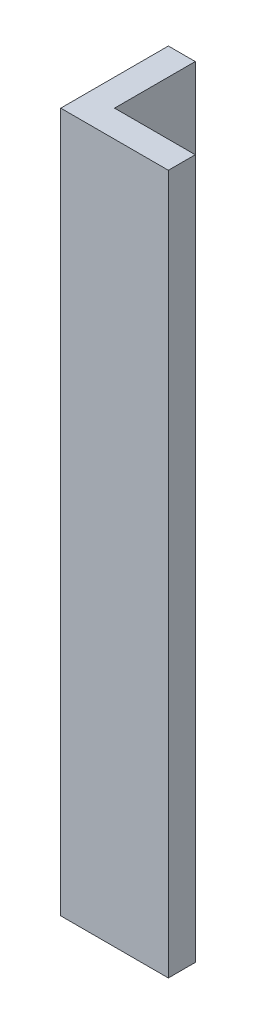
ISO-10303-21;
HEADER;
FILE_DESCRIPTION(('STEP AP214'),'2;1');
FILE_NAME('part.step','',(''),(''),'','','');
FILE_SCHEMA(('AUTOMOTIVE_DESIGN { 1 0 10303 214 1 1 1 1 }'));
ENDSEC;
DATA;
#1=APPLICATION_CONTEXT('core data for automotive mechanical design processes');
#2=APPLICATION_PROTOCOL_DEFINITION('international standard','automotive_design',2000,#1);
#3=PRODUCT_CONTEXT('',#1,'mechanical');
#4=PRODUCT('Part','Part','',(#3));
#5=PRODUCT_RELATED_PRODUCT_CATEGORY('part','',(#4));
#6=PRODUCT_DEFINITION_FORMATION('','',#4);
#7=PRODUCT_DEFINITION_CONTEXT('part definition',#1,'design');
#8=PRODUCT_DEFINITION('design','',#6,#7);
#9=PRODUCT_DEFINITION_SHAPE('','',#8);
#10=(LENGTH_UNIT() NAMED_UNIT(*) SI_UNIT(.MILLI.,.METRE.));
#11=(NAMED_UNIT(*) PLANE_ANGLE_UNIT() SI_UNIT($,.RADIAN.));
#12=(NAMED_UNIT(*) SI_UNIT($,.STERADIAN.) SOLID_ANGLE_UNIT());
#13=UNCERTAINTY_MEASURE_WITH_UNIT(LENGTH_MEASURE(1.E-05),#10,'distance_accuracy_value','');
#14=(GEOMETRIC_REPRESENTATION_CONTEXT(3) GLOBAL_UNCERTAINTY_ASSIGNED_CONTEXT((#13)) GLOBAL_UNIT_ASSIGNED_CONTEXT((#10,
#11,#12)) REPRESENTATION_CONTEXT('',''));
#15=CARTESIAN_POINT('',(0.,0.,0.));
#16=DIRECTION('',(0.,0.,1.));
#17=DIRECTION('',(1.,0.,0.));
#18=AXIS2_PLACEMENT_3D('',#15,#16,#17);
#19=CARTESIAN_POINT('',(3.09677419354837,130.,0.));
#20=DIRECTION('',(1.,0.,0.));
#21=DIRECTION('',(0.,0.,-1.));
#22=AXIS2_PLACEMENT_3D('',#19,#20,#21);
#23=PLANE('',#22);
#24=DIRECTION('',(0.,0.,1.));
#25=VECTOR('',#24,1.);
#26=CARTESIAN_POINT('',(3.09677419354837,0.,0.));
#27=LINE('',#26,#25);
#28=CARTESIAN_POINT('',(3.09677419354838,0.,5.64516129032258));
#29=VERTEX_POINT('',#28);
#30=CARTESIAN_POINT('',(3.09677419354839,0.,10.6451612903226));
#31=VERTEX_POINT('',#30);
#32=EDGE_CURVE('E127',#29,#31,#27,.T.);
#33=ORIENTED_EDGE('',*,*,#32,.F.);
#34=DIRECTION('',(0.,-1.,0.));
#35=VECTOR('',#34,1.);
#36=CARTESIAN_POINT('',(3.09677419354838,130.,5.64516129032258));
#37=LINE('',#36,#35);
#38=CARTESIAN_POINT('',(3.09677419354838,130.,5.64516129032258));
#39=VERTEX_POINT('',#38);
#40=EDGE_CURVE('E11',#39,#29,#37,.T.);
#41=ORIENTED_EDGE('',*,*,#40,.F.);
#42=DIRECTION('',(0.,0.,1.));
#43=VECTOR('',#42,1.);
#44=CARTESIAN_POINT('',(3.09677419354837,130.,0.));
#45=LINE('',#44,#43);
#46=CARTESIAN_POINT('',(3.09677419354839,130.,10.6451612903226));
#47=VERTEX_POINT('',#46);
#48=EDGE_CURVE('E146',#39,#47,#45,.T.);
#49=ORIENTED_EDGE('',*,*,#48,.T.);
#50=DIRECTION('',(0.,-1.,0.));
#51=VECTOR('',#50,1.);
#52=CARTESIAN_POINT('',(3.09677419354839,130.,10.6451612903226));
#53=LINE('',#52,#51);
#54=EDGE_CURVE('E84',#47,#31,#53,.T.);
#55=ORIENTED_EDGE('',*,*,#54,.T.);
#56=EDGE_LOOP('',(#33,#41,#49,#55));
#57=FACE_BOUND('',#56,.T.);
#58=ADVANCED_FACE('F39',(#57),#23,.T.);
#59=CARTESIAN_POINT('',(0.,130.,5.64516129032258));
#60=DIRECTION('',(0.,0.,-1.));
#61=DIRECTION('',(-1.,0.,0.));
#62=AXIS2_PLACEMENT_3D('',#59,#60,#61);
#63=PLANE('',#62);
#64=DIRECTION('',(1.,0.,0.));
#65=VECTOR('',#64,1.);
#66=CARTESIAN_POINT('',(0.,0.,5.64516129032258));
#67=LINE('',#66,#65);
#68=CARTESIAN_POINT('',(-11.9032258064516,0.,5.64516129032258));
#69=VERTEX_POINT('',#68);
#70=EDGE_CURVE('E131',#69,#29,#67,.T.);
#71=ORIENTED_EDGE('',*,*,#70,.F.);
#72=DIRECTION('',(0.,-1.,0.));
#73=VECTOR('',#72,1.);
#74=CARTESIAN_POINT('',(-11.9032258064516,130.,5.64516129032258));
#75=LINE('',#74,#73);
#76=CARTESIAN_POINT('',(-11.9032258064516,130.,5.64516129032258));
#77=VERTEX_POINT('',#76);
#78=EDGE_CURVE('E48',#77,#69,#75,.T.);
#79=ORIENTED_EDGE('',*,*,#78,.F.);
#80=DIRECTION('',(1.,0.,0.));
#81=VECTOR('',#80,1.);
#82=CARTESIAN_POINT('',(0.,130.,5.64516129032258));
#83=LINE('',#82,#81);
#84=EDGE_CURVE('E121',#77,#39,#83,.T.);
#85=ORIENTED_EDGE('',*,*,#84,.T.);
#86=ORIENTED_EDGE('',*,*,#40,.T.);
#87=EDGE_LOOP('',(#71,#79,#85,#86));
#88=FACE_BOUND('',#87,.T.);
#89=ADVANCED_FACE('F159',(#88),#63,.T.);
#90=CARTESIAN_POINT('',(-11.9032258064516,130.,0.));
#91=DIRECTION('',(1.,0.,0.));
#92=DIRECTION('',(0.,0.,-1.));
#93=AXIS2_PLACEMENT_3D('',#90,#91,#92);
#94=PLANE('',#93);
#95=DIRECTION('',(0.,0.,1.));
#96=VECTOR('',#95,1.);
#97=CARTESIAN_POINT('',(-11.9032258064516,0.,0.));
#98=LINE('',#97,#96);
#99=CARTESIAN_POINT('',(-11.9032258064516,0.,-9.35483870967742));
#100=VERTEX_POINT('',#99);
#101=EDGE_CURVE('E135',#100,#69,#98,.T.);
#102=ORIENTED_EDGE('',*,*,#101,.F.);
#103=DIRECTION('',(0.,-1.,0.));
#104=VECTOR('',#103,1.);
#105=CARTESIAN_POINT('',(-11.9032258064516,130.,-9.35483870967742));
#106=LINE('',#105,#104);
#107=CARTESIAN_POINT('',(-11.9032258064516,130.,-9.35483870967742));
#108=VERTEX_POINT('',#107);
#109=EDGE_CURVE('E106',#108,#100,#106,.T.);
#110=ORIENTED_EDGE('',*,*,#109,.F.);
#111=DIRECTION('',(0.,0.,1.));
#112=VECTOR('',#111,1.);
#113=CARTESIAN_POINT('',(-11.9032258064516,130.,0.));
#114=LINE('',#113,#112);
#115=EDGE_CURVE('E117',#108,#77,#114,.T.);
#116=ORIENTED_EDGE('',*,*,#115,.T.);
#117=ORIENTED_EDGE('',*,*,#78,.T.);
#118=EDGE_LOOP('',(#102,#110,#116,#117));
#119=FACE_BOUND('',#118,.T.);
#120=ADVANCED_FACE('F156',(#119),#94,.T.);
#121=CARTESIAN_POINT('',(0.,130.,-9.35483870967742));
#122=DIRECTION('',(0.,0.,-1.));
#123=DIRECTION('',(-1.,0.,0.));
#124=AXIS2_PLACEMENT_3D('',#121,#122,#123);
#125=PLANE('',#124);
#126=DIRECTION('',(1.,0.,0.));
#127=VECTOR('',#126,1.);
#128=CARTESIAN_POINT('',(0.,0.,-9.35483870967742));
#129=LINE('',#128,#127);
#130=CARTESIAN_POINT('',(-16.9032258064516,0.,-9.35483870967742));
#131=VERTEX_POINT('',#130);
#132=EDGE_CURVE('E104',#131,#100,#129,.T.);
#133=ORIENTED_EDGE('',*,*,#132,.F.);
#134=DIRECTION('',(0.,-1.,0.));
#135=VECTOR('',#134,1.);
#136=CARTESIAN_POINT('',(-16.9032258064516,130.,-9.35483870967742));
#137=LINE('',#136,#135);
#138=CARTESIAN_POINT('',(-16.9032258064516,130.,-9.35483870967742));
#139=VERTEX_POINT('',#138);
#140=EDGE_CURVE('E98',#139,#131,#137,.T.);
#141=ORIENTED_EDGE('',*,*,#140,.F.);
#142=DIRECTION('',(1.,0.,0.));
#143=VECTOR('',#142,1.);
#144=CARTESIAN_POINT('',(0.,130.,-9.35483870967742));
#145=LINE('',#144,#143);
#146=EDGE_CURVE('E102',#139,#108,#145,.T.);
#147=ORIENTED_EDGE('',*,*,#146,.T.);
#148=ORIENTED_EDGE('',*,*,#109,.T.);
#149=EDGE_LOOP('',(#133,#141,#147,#148));
#150=FACE_BOUND('',#149,.T.);
#151=ADVANCED_FACE('F100',(#150),#125,.T.);
#152=CARTESIAN_POINT('',(-16.9032258064516,130.,0.));
#153=DIRECTION('',(1.,0.,0.));
#154=DIRECTION('',(0.,0.,-1.));
#155=AXIS2_PLACEMENT_3D('',#152,#153,#154);
#156=PLANE('',#155);
#157=DIRECTION('',(0.,0.,1.));
#158=VECTOR('',#157,1.);
#159=CARTESIAN_POINT('',(-16.9032258064516,0.,0.));
#160=LINE('',#159,#158);
#161=CARTESIAN_POINT('',(-16.9032258064516,0.,10.6451612903226));
#162=VERTEX_POINT('',#161);
#163=EDGE_CURVE('E77',#131,#162,#160,.T.);
#164=ORIENTED_EDGE('',*,*,#163,.T.);
#165=DIRECTION('',(0.,-1.,0.));
#166=VECTOR('',#165,1.);
#167=CARTESIAN_POINT('',(-16.9032258064516,130.,10.6451612903226));
#168=LINE('',#167,#166);
#169=CARTESIAN_POINT('',(-16.9032258064516,130.,10.6451612903226));
#170=VERTEX_POINT('',#169);
#171=EDGE_CURVE('E107',#170,#162,#168,.T.);
#172=ORIENTED_EDGE('',*,*,#171,.F.);
#173=DIRECTION('',(0.,0.,1.));
#174=VECTOR('',#173,1.);
#175=CARTESIAN_POINT('',(-16.9032258064516,130.,0.));
#176=LINE('',#175,#174);
#177=EDGE_CURVE('E109',#139,#170,#176,.T.);
#178=ORIENTED_EDGE('',*,*,#177,.F.);
#179=ORIENTED_EDGE('',*,*,#140,.T.);
#180=EDGE_LOOP('',(#164,#172,#178,#179));
#181=FACE_BOUND('',#180,.T.);
#182=ADVANCED_FACE('F110',(#181),#156,.F.);
#183=CARTESIAN_POINT('',(0.,130.,10.6451612903226));
#184=DIRECTION('',(0.,0.,-1.));
#185=DIRECTION('',(-1.,0.,0.));
#186=AXIS2_PLACEMENT_3D('',#183,#184,#185);
#187=PLANE('',#186);
#188=DIRECTION('',(1.,0.,0.));
#189=VECTOR('',#188,1.);
#190=CARTESIAN_POINT('',(0.,0.,10.6451612903226));
#191=LINE('',#190,#189);
#192=EDGE_CURVE('E143',#162,#31,#191,.T.);
#193=ORIENTED_EDGE('',*,*,#192,.T.);
#194=ORIENTED_EDGE('',*,*,#54,.F.);
#195=DIRECTION('',(1.,0.,0.));
#196=VECTOR('',#195,1.);
#197=CARTESIAN_POINT('',(0.,130.,10.6451612903226));
#198=LINE('',#197,#196);
#199=EDGE_CURVE('E56',#170,#47,#198,.T.);
#200=ORIENTED_EDGE('',*,*,#199,.F.);
#201=ORIENTED_EDGE('',*,*,#171,.T.);
#202=EDGE_LOOP('',(#193,#194,#200,#201));
#203=FACE_BOUND('',#202,.T.);
#204=ADVANCED_FACE('F164',(#203),#187,.F.);
#205=CARTESIAN_POINT('',(0.,130.,0.));
#206=DIRECTION('',(0.,1.,0.));
#207=DIRECTION('',(0.,0.,1.));
#208=AXIS2_PLACEMENT_3D('',#205,#206,#207);
#209=PLANE('',#208);
#210=ORIENTED_EDGE('',*,*,#48,.F.);
#211=ORIENTED_EDGE('',*,*,#84,.F.);
#212=ORIENTED_EDGE('',*,*,#115,.F.);
#213=ORIENTED_EDGE('',*,*,#146,.F.);
#214=ORIENTED_EDGE('',*,*,#177,.T.);
#215=ORIENTED_EDGE('',*,*,#199,.T.);
#216=EDGE_LOOP('',(#210,#211,#212,#213,#214,#215));
#217=FACE_BOUND('',#216,.T.);
#218=ADVANCED_FACE('F114',(#217),#209,.T.);
#219=CARTESIAN_POINT('',(0.,0.,0.));
#220=DIRECTION('',(0.,1.,0.));
#221=DIRECTION('',(0.,0.,1.));
#222=AXIS2_PLACEMENT_3D('',#219,#220,#221);
#223=PLANE('',#222);
#224=ORIENTED_EDGE('',*,*,#32,.T.);
#225=ORIENTED_EDGE('',*,*,#192,.F.);
#226=ORIENTED_EDGE('',*,*,#163,.F.);
#227=ORIENTED_EDGE('',*,*,#132,.T.);
#228=ORIENTED_EDGE('',*,*,#101,.T.);
#229=ORIENTED_EDGE('',*,*,#70,.T.);
#230=EDGE_LOOP('',(#224,#225,#226,#227,#228,#229));
#231=FACE_BOUND('',#230,.T.);
#232=ADVANCED_FACE('F161',(#231),#223,.F.);
#233=CLOSED_SHELL('',(#58,#89,#120,#151,#182,#204,#218,#232));
#234=MANIFOLD_SOLID_BREP('B2',#233);
#235=ADVANCED_BREP_SHAPE_REPRESENTATION('',(#18,#234),#14);
#236=SHAPE_DEFINITION_REPRESENTATION(#9,#235);
ENDSEC;
END-ISO-10303-21;
